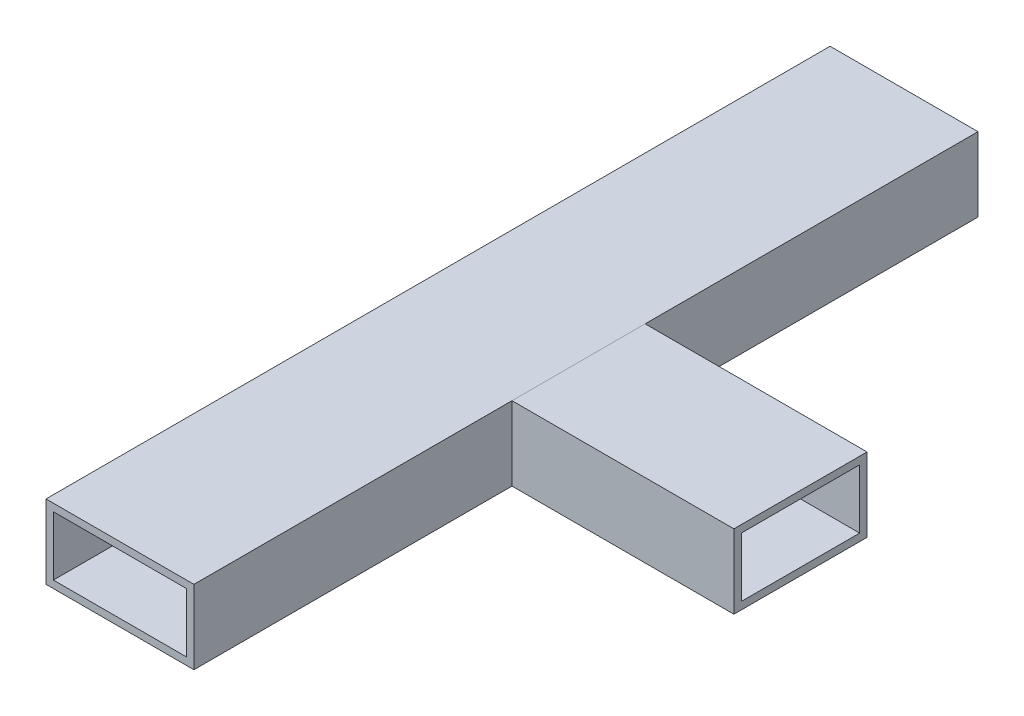
ISO-10303-21;
HEADER;
FILE_DESCRIPTION(('STEP AP214'),'2;1');
FILE_NAME('part.step','',(''),(''),'','','');
FILE_SCHEMA(('AUTOMOTIVE_DESIGN { 1 0 10303 214 1 1 1 1 }'));
ENDSEC;
DATA;
#1=APPLICATION_CONTEXT('core data for automotive mechanical design processes');
#2=APPLICATION_PROTOCOL_DEFINITION('international standard','automotive_design',2000,#1);
#3=PRODUCT_CONTEXT('',#1,'mechanical');
#4=PRODUCT('Part','Part','',(#3));
#5=PRODUCT_RELATED_PRODUCT_CATEGORY('part','',(#4));
#6=PRODUCT_DEFINITION_FORMATION('','',#4);
#7=PRODUCT_DEFINITION_CONTEXT('part definition',#1,'design');
#8=PRODUCT_DEFINITION('design','',#6,#7);
#9=PRODUCT_DEFINITION_SHAPE('','',#8);
#10=(LENGTH_UNIT() NAMED_UNIT(*) SI_UNIT(.MILLI.,.METRE.));
#11=(NAMED_UNIT(*) PLANE_ANGLE_UNIT() SI_UNIT($,.RADIAN.));
#12=(NAMED_UNIT(*) SI_UNIT($,.STERADIAN.) SOLID_ANGLE_UNIT());
#13=UNCERTAINTY_MEASURE_WITH_UNIT(LENGTH_MEASURE(1.E-05),#10,'distance_accuracy_value','');
#14=(GEOMETRIC_REPRESENTATION_CONTEXT(3) GLOBAL_UNCERTAINTY_ASSIGNED_CONTEXT((#13)) GLOBAL_UNIT_ASSIGNED_CONTEXT((#10,
#11,#12)) REPRESENTATION_CONTEXT('',''));
#15=CARTESIAN_POINT('',(0.,0.,0.));
#16=DIRECTION('',(0.,0.,1.));
#17=DIRECTION('',(1.,0.,0.));
#18=AXIS2_PLACEMENT_3D('',#15,#16,#17);
#19=CARTESIAN_POINT('',(40.,0.,0.));
#20=DIRECTION('',(1.,0.,0.));
#21=DIRECTION('',(0.,0.,-1.));
#22=AXIS2_PLACEMENT_3D('',#19,#20,#21);
#23=PLANE('',#22);
#24=DIRECTION('',(0.,0.,1.));
#25=VECTOR('',#24,1.);
#26=CARTESIAN_POINT('',(40.,5.,45.));
#27=LINE('',#26,#25);
#28=CARTESIAN_POINT('',(40.,5.,45.));
#29=VERTEX_POINT('',#28);
#30=CARTESIAN_POINT('',(40.,5.,63.));
#31=VERTEX_POINT('',#30);
#32=EDGE_CURVE('E150',#29,#31,#27,.T.);
#33=ORIENTED_EDGE('',*,*,#32,.T.);
#34=DIRECTION('',(0.,-1.,0.));
#35=VECTOR('',#34,1.);
#36=CARTESIAN_POINT('',(40.,5.,63.));
#37=LINE('',#36,#35);
#38=CARTESIAN_POINT('',(40.,-5.,63.));
#39=VERTEX_POINT('',#38);
#40=EDGE_CURVE('E153',#31,#39,#37,.T.);
#41=ORIENTED_EDGE('',*,*,#40,.T.);
#42=DIRECTION('',(0.,0.,-1.));
#43=VECTOR('',#42,1.);
#44=CARTESIAN_POINT('',(40.,-5.,63.));
#45=LINE('',#44,#43);
#46=CARTESIAN_POINT('',(40.,-5.,45.));
#47=VERTEX_POINT('',#46);
#48=EDGE_CURVE('E156',#39,#47,#45,.T.);
#49=ORIENTED_EDGE('',*,*,#48,.T.);
#50=DIRECTION('',(0.,1.,0.));
#51=VECTOR('',#50,1.);
#52=CARTESIAN_POINT('',(40.,-5.,45.));
#53=LINE('',#52,#51);
#54=EDGE_CURVE('E158',#47,#29,#53,.T.);
#55=ORIENTED_EDGE('',*,*,#54,.T.);
#56=EDGE_LOOP('',(#33,#41,#49,#55));
#57=FACE_BOUND('',#56,.T.);
#58=DIRECTION('',(0.,0.,1.));
#59=VECTOR('',#58,1.);
#60=CARTESIAN_POINT('',(40.,4.,46.));
#61=LINE('',#60,#59);
#62=CARTESIAN_POINT('',(40.,4.,46.));
#63=VERTEX_POINT('',#62);
#64=CARTESIAN_POINT('',(40.,4.,62.));
#65=VERTEX_POINT('',#64);
#66=EDGE_CURVE('E122',#63,#65,#61,.T.);
#67=ORIENTED_EDGE('',*,*,#66,.F.);
#68=DIRECTION('',(0.,1.,0.));
#69=VECTOR('',#68,1.);
#70=CARTESIAN_POINT('',(40.,-4.,46.));
#71=LINE('',#70,#69);
#72=CARTESIAN_POINT('',(40.,-4.,46.));
#73=VERTEX_POINT('',#72);
#74=EDGE_CURVE('E114',#73,#63,#71,.T.);
#75=ORIENTED_EDGE('',*,*,#74,.F.);
#76=DIRECTION('',(0.,0.,-1.));
#77=VECTOR('',#76,1.);
#78=CARTESIAN_POINT('',(40.,-4.,62.));
#79=LINE('',#78,#77);
#80=CARTESIAN_POINT('',(40.,-4.,62.));
#81=VERTEX_POINT('',#80);
#82=EDGE_CURVE('E136',#81,#73,#79,.T.);
#83=ORIENTED_EDGE('',*,*,#82,.F.);
#84=DIRECTION('',(0.,-1.,0.));
#85=VECTOR('',#84,1.);
#86=CARTESIAN_POINT('',(40.,4.,62.));
#87=LINE('',#86,#85);
#88=EDGE_CURVE('E134',#65,#81,#87,.T.);
#89=ORIENTED_EDGE('',*,*,#88,.F.);
#90=EDGE_LOOP('',(#67,#75,#83,#89));
#91=FACE_BOUND('',#90,.T.);
#92=ADVANCED_FACE('F49',(#57,#91),#23,.T.);
#93=CARTESIAN_POINT('',(10.,0.,0.));
#94=DIRECTION('',(1.,0.,0.));
#95=DIRECTION('',(0.,0.,-1.));
#96=AXIS2_PLACEMENT_3D('',#93,#94,#95);
#97=PLANE('',#96);
#98=DIRECTION('',(0.,0.,1.));
#99=VECTOR('',#98,1.);
#100=CARTESIAN_POINT('',(10.,5.,45.));
#101=LINE('',#100,#99);
#102=CARTESIAN_POINT('',(10.,5.,45.));
#103=VERTEX_POINT('',#102);
#104=CARTESIAN_POINT('',(10.,5.,63.));
#105=VERTEX_POINT('',#104);
#106=EDGE_CURVE('E130',#103,#105,#101,.T.);
#107=ORIENTED_EDGE('',*,*,#106,.F.);
#108=DIRECTION('',(0.,1.,0.));
#109=VECTOR('',#108,1.);
#110=CARTESIAN_POINT('',(10.,-5.,45.));
#111=LINE('',#110,#109);
#112=CARTESIAN_POINT('',(10.,-5.,45.));
#113=VERTEX_POINT('',#112);
#114=EDGE_CURVE('E154',#113,#103,#111,.T.);
#115=ORIENTED_EDGE('',*,*,#114,.F.);
#116=DIRECTION('',(0.,0.,-1.));
#117=VECTOR('',#116,1.);
#118=CARTESIAN_POINT('',(10.,-5.,63.));
#119=LINE('',#118,#117);
#120=CARTESIAN_POINT('',(10.,-5.,63.));
#121=VERTEX_POINT('',#120);
#122=EDGE_CURVE('E165',#121,#113,#119,.T.);
#123=ORIENTED_EDGE('',*,*,#122,.F.);
#124=DIRECTION('',(0.,-1.,0.));
#125=VECTOR('',#124,1.);
#126=CARTESIAN_POINT('',(10.,5.,63.));
#127=LINE('',#126,#125);
#128=EDGE_CURVE('E163',#105,#121,#127,.T.);
#129=ORIENTED_EDGE('',*,*,#128,.F.);
#130=EDGE_LOOP('',(#107,#115,#123,#129));
#131=FACE_BOUND('',#130,.T.);
#132=DIRECTION('',(0.,1.,0.));
#133=VECTOR('',#132,1.);
#134=CARTESIAN_POINT('',(10.,-4.,46.));
#135=LINE('',#134,#133);
#136=CARTESIAN_POINT('',(10.,-4.,46.));
#137=VERTEX_POINT('',#136);
#138=CARTESIAN_POINT('',(10.,4.,46.));
#139=VERTEX_POINT('',#138);
#140=EDGE_CURVE('E72',#137,#139,#135,.T.);
#141=ORIENTED_EDGE('',*,*,#140,.T.);
#142=DIRECTION('',(0.,0.,1.));
#143=VECTOR('',#142,1.);
#144=CARTESIAN_POINT('',(10.,4.,46.));
#145=LINE('',#144,#143);
#146=CARTESIAN_POINT('',(10.,4.,62.));
#147=VERTEX_POINT('',#146);
#148=EDGE_CURVE('E129',#139,#147,#145,.T.);
#149=ORIENTED_EDGE('',*,*,#148,.T.);
#150=DIRECTION('',(0.,-1.,0.));
#151=VECTOR('',#150,1.);
#152=CARTESIAN_POINT('',(10.,4.,62.));
#153=LINE('',#152,#151);
#154=CARTESIAN_POINT('',(10.,-4.,62.));
#155=VERTEX_POINT('',#154);
#156=EDGE_CURVE('E142',#147,#155,#153,.T.);
#157=ORIENTED_EDGE('',*,*,#156,.T.);
#158=DIRECTION('',(0.,0.,-1.));
#159=VECTOR('',#158,1.);
#160=CARTESIAN_POINT('',(10.,-4.,62.));
#161=LINE('',#160,#159);
#162=EDGE_CURVE('E123',#155,#137,#161,.T.);
#163=ORIENTED_EDGE('',*,*,#162,.T.);
#164=EDGE_LOOP('',(#141,#149,#157,#163));
#165=FACE_BOUND('',#164,.T.);
#166=ADVANCED_FACE('F183',(#131,#165),#97,.F.);
#167=CARTESIAN_POINT('',(40.,5.,45.));
#168=DIRECTION('',(0.,-1.,0.));
#169=DIRECTION('',(0.,0.,-1.));
#170=AXIS2_PLACEMENT_3D('',#167,#168,#169);
#171=PLANE('',#170);
#172=ORIENTED_EDGE('',*,*,#106,.T.);
#173=DIRECTION('',(-1.,0.,0.));
#174=VECTOR('',#173,1.);
#175=CARTESIAN_POINT('',(40.,5.,63.));
#176=LINE('',#175,#174);
#177=EDGE_CURVE('E12',#31,#105,#176,.T.);
#178=ORIENTED_EDGE('',*,*,#177,.F.);
#179=ORIENTED_EDGE('',*,*,#32,.F.);
#180=DIRECTION('',(-1.,0.,0.));
#181=VECTOR('',#180,1.);
#182=CARTESIAN_POINT('',(40.,5.,45.));
#183=LINE('',#182,#181);
#184=EDGE_CURVE('E160',#29,#103,#183,.T.);
#185=ORIENTED_EDGE('',*,*,#184,.T.);
#186=EDGE_LOOP('',(#172,#178,#179,#185));
#187=FACE_BOUND('',#186,.T.);
#188=ADVANCED_FACE('F51',(#187),#171,.F.);
#189=CARTESIAN_POINT('',(40.,5.,63.));
#190=DIRECTION('',(0.,0.,-1.));
#191=DIRECTION('',(-1.,0.,0.));
#192=AXIS2_PLACEMENT_3D('',#189,#190,#191);
#193=PLANE('',#192);
#194=ORIENTED_EDGE('',*,*,#128,.T.);
#195=DIRECTION('',(-1.,0.,0.));
#196=VECTOR('',#195,1.);
#197=CARTESIAN_POINT('',(40.,-5.,63.));
#198=LINE('',#197,#196);
#199=EDGE_CURVE('E57',#39,#121,#198,.T.);
#200=ORIENTED_EDGE('',*,*,#199,.F.);
#201=ORIENTED_EDGE('',*,*,#40,.F.);
#202=ORIENTED_EDGE('',*,*,#177,.T.);
#203=EDGE_LOOP('',(#194,#200,#201,#202));
#204=FACE_BOUND('',#203,.T.);
#205=ADVANCED_FACE('F193',(#204),#193,.F.);
#206=CARTESIAN_POINT('',(40.,-5.,63.));
#207=DIRECTION('',(0.,1.,0.));
#208=DIRECTION('',(0.,0.,1.));
#209=AXIS2_PLACEMENT_3D('',#206,#207,#208);
#210=PLANE('',#209);
#211=ORIENTED_EDGE('',*,*,#122,.T.);
#212=DIRECTION('',(-1.,0.,0.));
#213=VECTOR('',#212,1.);
#214=CARTESIAN_POINT('',(40.,-5.,45.));
#215=LINE('',#214,#213);
#216=EDGE_CURVE('E170',#47,#113,#215,.T.);
#217=ORIENTED_EDGE('',*,*,#216,.F.);
#218=ORIENTED_EDGE('',*,*,#48,.F.);
#219=ORIENTED_EDGE('',*,*,#199,.T.);
#220=EDGE_LOOP('',(#211,#217,#218,#219));
#221=FACE_BOUND('',#220,.T.);
#222=ADVANCED_FACE('F177',(#221),#210,.F.);
#223=CARTESIAN_POINT('',(40.,-5.,45.));
#224=DIRECTION('',(0.,0.,1.));
#225=DIRECTION('',(1.,0.,0.));
#226=AXIS2_PLACEMENT_3D('',#223,#224,#225);
#227=PLANE('',#226);
#228=ORIENTED_EDGE('',*,*,#114,.T.);
#229=ORIENTED_EDGE('',*,*,#184,.F.);
#230=ORIENTED_EDGE('',*,*,#54,.F.);
#231=ORIENTED_EDGE('',*,*,#216,.T.);
#232=EDGE_LOOP('',(#228,#229,#230,#231));
#233=FACE_BOUND('',#232,.T.);
#234=ADVANCED_FACE('F187',(#233),#227,.F.);
#235=CARTESIAN_POINT('',(40.,-4.,46.));
#236=DIRECTION('',(0.,0.,1.));
#237=DIRECTION('',(1.,0.,0.));
#238=AXIS2_PLACEMENT_3D('',#235,#236,#237);
#239=PLANE('',#238);
#240=ORIENTED_EDGE('',*,*,#140,.F.);
#241=DIRECTION('',(-1.,0.,0.));
#242=VECTOR('',#241,1.);
#243=CARTESIAN_POINT('',(40.,-4.,46.));
#244=LINE('',#243,#242);
#245=EDGE_CURVE('E118',#73,#137,#244,.T.);
#246=ORIENTED_EDGE('',*,*,#245,.F.);
#247=ORIENTED_EDGE('',*,*,#74,.T.);
#248=DIRECTION('',(-1.,0.,0.));
#249=VECTOR('',#248,1.);
#250=CARTESIAN_POINT('',(40.,4.,46.));
#251=LINE('',#250,#249);
#252=EDGE_CURVE('E117',#63,#139,#251,.T.);
#253=ORIENTED_EDGE('',*,*,#252,.T.);
#254=EDGE_LOOP('',(#240,#246,#247,#253));
#255=FACE_BOUND('',#254,.T.);
#256=ADVANCED_FACE('F116',(#255),#239,.T.);
#257=CARTESIAN_POINT('',(40.,4.,46.));
#258=DIRECTION('',(0.,-1.,0.));
#259=DIRECTION('',(0.,0.,-1.));
#260=AXIS2_PLACEMENT_3D('',#257,#258,#259);
#261=PLANE('',#260);
#262=ORIENTED_EDGE('',*,*,#148,.F.);
#263=ORIENTED_EDGE('',*,*,#252,.F.);
#264=ORIENTED_EDGE('',*,*,#66,.T.);
#265=DIRECTION('',(-1.,0.,0.));
#266=VECTOR('',#265,1.);
#267=CARTESIAN_POINT('',(40.,4.,62.));
#268=LINE('',#267,#266);
#269=EDGE_CURVE('E131',#65,#147,#268,.T.);
#270=ORIENTED_EDGE('',*,*,#269,.T.);
#271=EDGE_LOOP('',(#262,#263,#264,#270));
#272=FACE_BOUND('',#271,.T.);
#273=ADVANCED_FACE('F126',(#272),#261,.T.);
#274=CARTESIAN_POINT('',(40.,4.,62.));
#275=DIRECTION('',(0.,0.,-1.));
#276=DIRECTION('',(-1.,0.,0.));
#277=AXIS2_PLACEMENT_3D('',#274,#275,#276);
#278=PLANE('',#277);
#279=ORIENTED_EDGE('',*,*,#156,.F.);
#280=ORIENTED_EDGE('',*,*,#269,.F.);
#281=ORIENTED_EDGE('',*,*,#88,.T.);
#282=DIRECTION('',(-1.,0.,0.));
#283=VECTOR('',#282,1.);
#284=CARTESIAN_POINT('',(40.,-4.,62.));
#285=LINE('',#284,#283);
#286=EDGE_CURVE('E64',#81,#155,#285,.T.);
#287=ORIENTED_EDGE('',*,*,#286,.T.);
#288=EDGE_LOOP('',(#279,#280,#281,#287));
#289=FACE_BOUND('',#288,.T.);
#290=ADVANCED_FACE('F216',(#289),#278,.T.);
#291=CARTESIAN_POINT('',(40.,-4.,62.));
#292=DIRECTION('',(0.,1.,0.));
#293=DIRECTION('',(0.,0.,1.));
#294=AXIS2_PLACEMENT_3D('',#291,#292,#293);
#295=PLANE('',#294);
#296=ORIENTED_EDGE('',*,*,#162,.F.);
#297=ORIENTED_EDGE('',*,*,#286,.F.);
#298=ORIENTED_EDGE('',*,*,#82,.T.);
#299=ORIENTED_EDGE('',*,*,#245,.T.);
#300=EDGE_LOOP('',(#296,#297,#298,#299));
#301=FACE_BOUND('',#300,.T.);
#302=ADVANCED_FACE('F220',(#301),#295,.T.);
#303=CLOSED_SHELL('',(#92,#166,#188,#205,#222,#234,#256,#273,#290,#302));
#304=MANIFOLD_SOLID_BREP('B2',#303);
#305=CARTESIAN_POINT('',(0.,0.,106.));
#306=DIRECTION('',(0.,0.,1.));
#307=DIRECTION('',(1.,0.,0.));
#308=AXIS2_PLACEMENT_3D('',#305,#306,#307);
#309=PLANE('',#308);
#310=DIRECTION('',(0.,-1.,0.));
#311=VECTOR('',#310,1.);
#312=CARTESIAN_POINT('',(-10.,-5.,106.));
#313=LINE('',#312,#311);
#314=CARTESIAN_POINT('',(-10.,5.,106.));
#315=VERTEX_POINT('',#314);
#316=CARTESIAN_POINT('',(-10.,-5.,106.));
#317=VERTEX_POINT('',#316);
#318=EDGE_CURVE('E393',#315,#317,#313,.T.);
#319=ORIENTED_EDGE('',*,*,#318,.T.);
#320=DIRECTION('',(1.,0.,0.));
#321=VECTOR('',#320,1.);
#322=CARTESIAN_POINT('',(10.,-5.,106.));
#323=LINE('',#322,#321);
#324=CARTESIAN_POINT('',(10.,-5.,106.));
#325=VERTEX_POINT('',#324);
#326=EDGE_CURVE('E397',#317,#325,#323,.T.);
#327=ORIENTED_EDGE('',*,*,#326,.T.);
#328=DIRECTION('',(0.,1.,0.));
#329=VECTOR('',#328,1.);
#330=CARTESIAN_POINT('',(10.,-5.,106.));
#331=LINE('',#330,#329);
#332=CARTESIAN_POINT('',(10.,5.,106.));
#333=VERTEX_POINT('',#332);
#334=EDGE_CURVE('E401',#325,#333,#331,.T.);
#335=ORIENTED_EDGE('',*,*,#334,.T.);
#336=DIRECTION('',(-1.,0.,0.));
#337=VECTOR('',#336,1.);
#338=CARTESIAN_POINT('',(10.,5.,106.));
#339=LINE('',#338,#337);
#340=EDGE_CURVE('E404',#333,#315,#339,.T.);
#341=ORIENTED_EDGE('',*,*,#340,.T.);
#342=EDGE_LOOP('',(#319,#327,#335,#341));
#343=FACE_BOUND('',#342,.T.);
#344=DIRECTION('',(1.,0.,0.));
#345=VECTOR('',#344,1.);
#346=CARTESIAN_POINT('',(9.,-4.,106.));
#347=LINE('',#346,#345);
#348=CARTESIAN_POINT('',(-9.,-4.,106.));
#349=VERTEX_POINT('',#348);
#350=CARTESIAN_POINT('',(9.,-4.,106.));
#351=VERTEX_POINT('',#350);
#352=EDGE_CURVE('E354',#349,#351,#347,.T.);
#353=ORIENTED_EDGE('',*,*,#352,.F.);
#354=DIRECTION('',(0.,-1.,0.));
#355=VECTOR('',#354,1.);
#356=CARTESIAN_POINT('',(-9.,-4.,106.));
#357=LINE('',#356,#355);
#358=CARTESIAN_POINT('',(-9.,4.,106.));
#359=VERTEX_POINT('',#358);
#360=EDGE_CURVE('E345',#359,#349,#357,.T.);
#361=ORIENTED_EDGE('',*,*,#360,.F.);
#362=DIRECTION('',(-1.,0.,0.));
#363=VECTOR('',#362,1.);
#364=CARTESIAN_POINT('',(9.,4.,106.));
#365=LINE('',#364,#363);
#366=CARTESIAN_POINT('',(9.,4.,106.));
#367=VERTEX_POINT('',#366);
#368=EDGE_CURVE('E371',#367,#359,#365,.T.);
#369=ORIENTED_EDGE('',*,*,#368,.F.);
#370=DIRECTION('',(0.,1.,0.));
#371=VECTOR('',#370,1.);
#372=CARTESIAN_POINT('',(9.,-4.,106.));
#373=LINE('',#372,#371);
#374=EDGE_CURVE('E367',#351,#367,#373,.T.);
#375=ORIENTED_EDGE('',*,*,#374,.F.);
#376=EDGE_LOOP('',(#353,#361,#369,#375));
#377=FACE_BOUND('',#376,.T.);
#378=ADVANCED_FACE('F279',(#343,#377),#309,.T.);
#379=CARTESIAN_POINT('',(0.,0.,0.));
#380=DIRECTION('',(0.,0.,1.));
#381=DIRECTION('',(1.,0.,0.));
#382=AXIS2_PLACEMENT_3D('',#379,#380,#381);
#383=PLANE('',#382);
#384=DIRECTION('',(0.,-1.,0.));
#385=VECTOR('',#384,1.);
#386=CARTESIAN_POINT('',(-10.,-5.,0.));
#387=LINE('',#386,#385);
#388=CARTESIAN_POINT('',(-10.,5.,0.));
#389=VERTEX_POINT('',#388);
#390=CARTESIAN_POINT('',(-10.,-5.,0.));
#391=VERTEX_POINT('',#390);
#392=EDGE_CURVE('E363',#389,#391,#387,.T.);
#393=ORIENTED_EDGE('',*,*,#392,.F.);
#394=DIRECTION('',(-1.,0.,0.));
#395=VECTOR('',#394,1.);
#396=CARTESIAN_POINT('',(10.,5.,0.));
#397=LINE('',#396,#395);
#398=CARTESIAN_POINT('',(10.,5.,0.));
#399=VERTEX_POINT('',#398);
#400=EDGE_CURVE('E398',#399,#389,#397,.T.);
#401=ORIENTED_EDGE('',*,*,#400,.F.);
#402=DIRECTION('',(0.,1.,0.));
#403=VECTOR('',#402,1.);
#404=CARTESIAN_POINT('',(10.,-5.,0.));
#405=LINE('',#404,#403);
#406=CARTESIAN_POINT('',(10.,-5.,0.));
#407=VERTEX_POINT('',#406);
#408=EDGE_CURVE('E414',#407,#399,#405,.T.);
#409=ORIENTED_EDGE('',*,*,#408,.F.);
#410=DIRECTION('',(1.,0.,0.));
#411=VECTOR('',#410,1.);
#412=CARTESIAN_POINT('',(10.,-5.,0.));
#413=LINE('',#412,#411);
#414=EDGE_CURVE('E411',#391,#407,#413,.T.);
#415=ORIENTED_EDGE('',*,*,#414,.F.);
#416=EDGE_LOOP('',(#393,#401,#409,#415));
#417=FACE_BOUND('',#416,.T.);
#418=DIRECTION('',(0.,-1.,0.));
#419=VECTOR('',#418,1.);
#420=CARTESIAN_POINT('',(-9.,-4.,0.));
#421=LINE('',#420,#419);
#422=CARTESIAN_POINT('',(-9.,4.,0.));
#423=VERTEX_POINT('',#422);
#424=CARTESIAN_POINT('',(-9.,-4.,0.));
#425=VERTEX_POINT('',#424);
#426=EDGE_CURVE('E303',#423,#425,#421,.T.);
#427=ORIENTED_EDGE('',*,*,#426,.T.);
#428=DIRECTION('',(1.,0.,0.));
#429=VECTOR('',#428,1.);
#430=CARTESIAN_POINT('',(9.,-4.,0.));
#431=LINE('',#430,#429);
#432=CARTESIAN_POINT('',(9.,-4.,0.));
#433=VERTEX_POINT('',#432);
#434=EDGE_CURVE('E361',#425,#433,#431,.T.);
#435=ORIENTED_EDGE('',*,*,#434,.T.);
#436=DIRECTION('',(0.,1.,0.));
#437=VECTOR('',#436,1.);
#438=CARTESIAN_POINT('',(9.,-4.,0.));
#439=LINE('',#438,#437);
#440=CARTESIAN_POINT('',(9.,4.,0.));
#441=VERTEX_POINT('',#440);
#442=EDGE_CURVE('E380',#433,#441,#439,.T.);
#443=ORIENTED_EDGE('',*,*,#442,.T.);
#444=DIRECTION('',(-1.,0.,0.));
#445=VECTOR('',#444,1.);
#446=CARTESIAN_POINT('',(9.,4.,0.));
#447=LINE('',#446,#445);
#448=EDGE_CURVE('E355',#441,#423,#447,.T.);
#449=ORIENTED_EDGE('',*,*,#448,.T.);
#450=EDGE_LOOP('',(#427,#435,#443,#449));
#451=FACE_BOUND('',#450,.T.);
#452=ADVANCED_FACE('F437',(#417,#451),#383,.F.);
#453=CARTESIAN_POINT('',(-10.,-5.,106.));
#454=DIRECTION('',(1.,0.,0.));
#455=DIRECTION('',(0.,1.,0.));
#456=AXIS2_PLACEMENT_3D('',#453,#454,#455);
#457=PLANE('',#456);
#458=ORIENTED_EDGE('',*,*,#392,.T.);
#459=DIRECTION('',(0.,0.,-1.));
#460=VECTOR('',#459,1.);
#461=CARTESIAN_POINT('',(-10.,-5.,106.));
#462=LINE('',#461,#460);
#463=EDGE_CURVE('E47',#317,#391,#462,.T.);
#464=ORIENTED_EDGE('',*,*,#463,.F.);
#465=ORIENTED_EDGE('',*,*,#318,.F.);
#466=DIRECTION('',(0.,0.,-1.));
#467=VECTOR('',#466,1.);
#468=CARTESIAN_POINT('',(-10.,5.,106.));
#469=LINE('',#468,#467);
#470=EDGE_CURVE('E407',#315,#389,#469,.T.);
#471=ORIENTED_EDGE('',*,*,#470,.T.);
#472=EDGE_LOOP('',(#458,#464,#465,#471));
#473=FACE_BOUND('',#472,.T.);
#474=ADVANCED_FACE('F281',(#473),#457,.F.);
#475=CARTESIAN_POINT('',(10.,-5.,106.));
#476=DIRECTION('',(0.,1.,0.));
#477=DIRECTION('',(-1.,0.,0.));
#478=AXIS2_PLACEMENT_3D('',#475,#476,#477);
#479=PLANE('',#478);
#480=ORIENTED_EDGE('',*,*,#414,.T.);
#481=DIRECTION('',(0.,0.,-1.));
#482=VECTOR('',#481,1.);
#483=CARTESIAN_POINT('',(10.,-5.,106.));
#484=LINE('',#483,#482);
#485=EDGE_CURVE('E288',#325,#407,#484,.T.);
#486=ORIENTED_EDGE('',*,*,#485,.F.);
#487=ORIENTED_EDGE('',*,*,#326,.F.);
#488=ORIENTED_EDGE('',*,*,#463,.T.);
#489=EDGE_LOOP('',(#480,#486,#487,#488));
#490=FACE_BOUND('',#489,.T.);
#491=ADVANCED_FACE('F447',(#490),#479,.F.);
#492=CARTESIAN_POINT('',(10.,-5.,106.));
#493=DIRECTION('',(-1.,0.,0.));
#494=DIRECTION('',(0.,0.,1.));
#495=AXIS2_PLACEMENT_3D('',#492,#493,#494);
#496=PLANE('',#495);
#497=ORIENTED_EDGE('',*,*,#408,.T.);
#498=DIRECTION('',(0.,0.,-1.));
#499=VECTOR('',#498,1.);
#500=CARTESIAN_POINT('',(10.,5.,106.));
#501=LINE('',#500,#499);
#502=EDGE_CURVE('E422',#333,#399,#501,.T.);
#503=ORIENTED_EDGE('',*,*,#502,.F.);
#504=ORIENTED_EDGE('',*,*,#334,.F.);
#505=ORIENTED_EDGE('',*,*,#485,.T.);
#506=EDGE_LOOP('',(#497,#503,#504,#505));
#507=FACE_BOUND('',#506,.T.);
#508=ADVANCED_FACE('F431',(#507),#496,.F.);
#509=CARTESIAN_POINT('',(10.,5.,106.));
#510=DIRECTION('',(0.,-1.,0.));
#511=DIRECTION('',(1.,0.,0.));
#512=AXIS2_PLACEMENT_3D('',#509,#510,#511);
#513=PLANE('',#512);
#514=ORIENTED_EDGE('',*,*,#400,.T.);
#515=ORIENTED_EDGE('',*,*,#470,.F.);
#516=ORIENTED_EDGE('',*,*,#340,.F.);
#517=ORIENTED_EDGE('',*,*,#502,.T.);
#518=EDGE_LOOP('',(#514,#515,#516,#517));
#519=FACE_BOUND('',#518,.T.);
#520=ADVANCED_FACE('F441',(#519),#513,.F.);
#521=CARTESIAN_POINT('',(-9.,-4.,106.));
#522=DIRECTION('',(1.,0.,0.));
#523=DIRECTION('',(0.,0.,-1.));
#524=AXIS2_PLACEMENT_3D('',#521,#522,#523);
#525=PLANE('',#524);
#526=ORIENTED_EDGE('',*,*,#426,.F.);
#527=DIRECTION('',(0.,0.,-1.));
#528=VECTOR('',#527,1.);
#529=CARTESIAN_POINT('',(-9.,4.,106.));
#530=LINE('',#529,#528);
#531=EDGE_CURVE('E349',#359,#423,#530,.T.);
#532=ORIENTED_EDGE('',*,*,#531,.F.);
#533=ORIENTED_EDGE('',*,*,#360,.T.);
#534=DIRECTION('',(0.,0.,-1.));
#535=VECTOR('',#534,1.);
#536=CARTESIAN_POINT('',(-9.,-4.,106.));
#537=LINE('',#536,#535);
#538=EDGE_CURVE('E348',#349,#425,#537,.T.);
#539=ORIENTED_EDGE('',*,*,#538,.T.);
#540=EDGE_LOOP('',(#526,#532,#533,#539));
#541=FACE_BOUND('',#540,.T.);
#542=ADVANCED_FACE('F347',(#541),#525,.T.);
#543=CARTESIAN_POINT('',(9.,-4.,106.));
#544=DIRECTION('',(0.,1.,0.));
#545=DIRECTION('',(-1.,0.,0.));
#546=AXIS2_PLACEMENT_3D('',#543,#544,#545);
#547=PLANE('',#546);
#548=ORIENTED_EDGE('',*,*,#434,.F.);
#549=ORIENTED_EDGE('',*,*,#538,.F.);
#550=ORIENTED_EDGE('',*,*,#352,.T.);
#551=DIRECTION('',(0.,0.,-1.));
#552=VECTOR('',#551,1.);
#553=CARTESIAN_POINT('',(9.,-4.,106.));
#554=LINE('',#553,#552);
#555=EDGE_CURVE('E364',#351,#433,#554,.T.);
#556=ORIENTED_EDGE('',*,*,#555,.T.);
#557=EDGE_LOOP('',(#548,#549,#550,#556));
#558=FACE_BOUND('',#557,.T.);
#559=ADVANCED_FACE('F358',(#558),#547,.T.);
#560=CARTESIAN_POINT('',(9.,-4.,106.));
#561=DIRECTION('',(-1.,0.,0.));
#562=DIRECTION('',(0.,-1.,0.));
#563=AXIS2_PLACEMENT_3D('',#560,#561,#562);
#564=PLANE('',#563);
#565=ORIENTED_EDGE('',*,*,#442,.F.);
#566=ORIENTED_EDGE('',*,*,#555,.F.);
#567=ORIENTED_EDGE('',*,*,#374,.T.);
#568=DIRECTION('',(0.,0.,-1.));
#569=VECTOR('',#568,1.);
#570=CARTESIAN_POINT('',(9.,4.,106.));
#571=LINE('',#570,#569);
#572=EDGE_CURVE('E295',#367,#441,#571,.T.);
#573=ORIENTED_EDGE('',*,*,#572,.T.);
#574=EDGE_LOOP('',(#565,#566,#567,#573));
#575=FACE_BOUND('',#574,.T.);
#576=ADVANCED_FACE('F470',(#575),#564,.T.);
#577=CARTESIAN_POINT('',(9.,4.,106.));
#578=DIRECTION('',(0.,-1.,0.));
#579=DIRECTION('',(1.,0.,0.));
#580=AXIS2_PLACEMENT_3D('',#577,#578,#579);
#581=PLANE('',#580);
#582=ORIENTED_EDGE('',*,*,#448,.F.);
#583=ORIENTED_EDGE('',*,*,#572,.F.);
#584=ORIENTED_EDGE('',*,*,#368,.T.);
#585=ORIENTED_EDGE('',*,*,#531,.T.);
#586=EDGE_LOOP('',(#582,#583,#584,#585));
#587=FACE_BOUND('',#586,.T.);
#588=ADVANCED_FACE('F474',(#587),#581,.T.);
#589=CLOSED_SHELL('',(#378,#452,#474,#491,#508,#520,#542,#559,#576,#588));
#590=MANIFOLD_SOLID_BREP('B6',#589);
#591=ADVANCED_BREP_SHAPE_REPRESENTATION('',(#18,#304,#590),#14);
#592=SHAPE_DEFINITION_REPRESENTATION(#9,#591);
ENDSEC;
END-ISO-10303-21;
